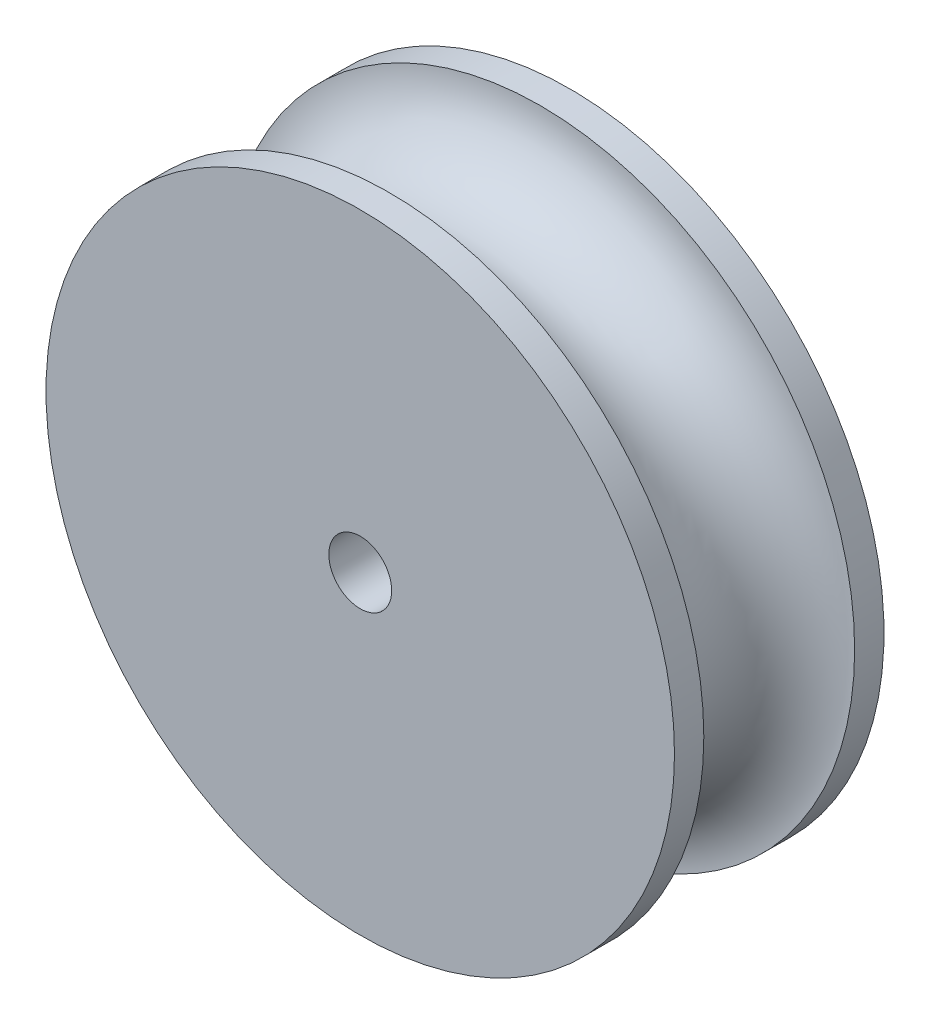
ISO-10303-21;
HEADER;
FILE_DESCRIPTION(('STEP AP214'),'2;1');
FILE_NAME('part.step','',(''),(''),'','','');
FILE_SCHEMA(('AUTOMOTIVE_DESIGN { 1 0 10303 214 1 1 1 1 }'));
ENDSEC;
DATA;
#1=APPLICATION_CONTEXT('core data for automotive mechanical design processes');
#2=APPLICATION_PROTOCOL_DEFINITION('international standard','automotive_design',2000,#1);
#3=PRODUCT_CONTEXT('',#1,'mechanical');
#4=PRODUCT('Part','Part','',(#3));
#5=PRODUCT_RELATED_PRODUCT_CATEGORY('part','',(#4));
#6=PRODUCT_DEFINITION_FORMATION('','',#4);
#7=PRODUCT_DEFINITION_CONTEXT('part definition',#1,'design');
#8=PRODUCT_DEFINITION('design','',#6,#7);
#9=PRODUCT_DEFINITION_SHAPE('','',#8);
#10=(LENGTH_UNIT() NAMED_UNIT(*) SI_UNIT(.MILLI.,.METRE.));
#11=(NAMED_UNIT(*) PLANE_ANGLE_UNIT() SI_UNIT($,.RADIAN.));
#12=(NAMED_UNIT(*) SI_UNIT($,.STERADIAN.) SOLID_ANGLE_UNIT());
#13=UNCERTAINTY_MEASURE_WITH_UNIT(LENGTH_MEASURE(1.E-05),#10,'distance_accuracy_value','');
#14=(GEOMETRIC_REPRESENTATION_CONTEXT(3) GLOBAL_UNCERTAINTY_ASSIGNED_CONTEXT((#13)) GLOBAL_UNIT_ASSIGNED_CONTEXT((#10,
#11,#12)) REPRESENTATION_CONTEXT('',''));
#15=CARTESIAN_POINT('',(0.,0.,0.));
#16=DIRECTION('',(0.,0.,1.));
#17=DIRECTION('',(1.,0.,0.));
#18=AXIS2_PLACEMENT_3D('',#15,#16,#17);
#19=CARTESIAN_POINT('',(0.,0.,-9.144));
#20=DIRECTION('',(0.,0.,1.));
#21=DIRECTION('',(1.,0.,0.));
#22=AXIS2_PLACEMENT_3D('',#19,#20,#21);
#23=TOROIDAL_SURFACE('',#22,38.1,9.144);
#24=CARTESIAN_POINT('',(0.,0.,0.));
#25=DIRECTION('',(0.,0.,1.));
#26=DIRECTION('',(1.,0.,0.));
#27=AXIS2_PLACEMENT_3D('',#24,#25,#26);
#28=CIRCLE('',#27,38.1);
#29=CARTESIAN_POINT('',(38.1,0.,0.));
#30=VERTEX_POINT('',#29);
#31=EDGE_CURVE('E10',#30,#30,#28,.T.);
#32=ORIENTED_EDGE('',*,*,#31,.F.);
#33=EDGE_LOOP('',(#32));
#34=FACE_BOUND('',#33,.T.);
#35=CARTESIAN_POINT('',(0.,0.,-18.288));
#36=DIRECTION('',(0.,0.,-1.));
#37=DIRECTION('',(-1.,0.,0.));
#38=AXIS2_PLACEMENT_3D('',#35,#36,#37);
#39=CIRCLE('',#38,38.1);
#40=CARTESIAN_POINT('',(-38.1,0.,-18.288));
#41=VERTEX_POINT('',#40);
#42=EDGE_CURVE('E57',#41,#41,#39,.T.);
#43=ORIENTED_EDGE('',*,*,#42,.F.);
#44=EDGE_LOOP('',(#43));
#45=FACE_BOUND('',#44,.T.);
#46=ADVANCED_FACE('F40',(#34,#45),#23,.F.);
#47=CARTESIAN_POINT('',(0.,0.,3.556));
#48=DIRECTION('',(0.,0.,-1.));
#49=DIRECTION('',(-1.,0.,0.));
#50=AXIS2_PLACEMENT_3D('',#47,#48,#49);
#51=CYLINDRICAL_SURFACE('',#50,38.1);
#52=CARTESIAN_POINT('',(0.,0.,3.556));
#53=DIRECTION('',(0.,0.,1.));
#54=DIRECTION('',(1.,0.,0.));
#55=AXIS2_PLACEMENT_3D('',#52,#53,#54);
#56=CIRCLE('',#55,38.1);
#57=CARTESIAN_POINT('',(38.1,0.,3.556));
#58=VERTEX_POINT('',#57);
#59=EDGE_CURVE('E47',#58,#58,#56,.T.);
#60=ORIENTED_EDGE('',*,*,#59,.F.);
#61=EDGE_LOOP('',(#60));
#62=FACE_BOUND('',#61,.T.);
#63=ORIENTED_EDGE('',*,*,#31,.T.);
#64=EDGE_LOOP('',(#63));
#65=FACE_BOUND('',#64,.T.);
#66=ADVANCED_FACE('F77',(#62,#65),#51,.T.);
#67=CARTESIAN_POINT('',(0.,0.,3.556));
#68=DIRECTION('',(0.,0.,1.));
#69=DIRECTION('',(1.,0.,0.));
#70=AXIS2_PLACEMENT_3D('',#67,#68,#69);
#71=PLANE('',#70);
#72=CARTESIAN_POINT('',(0.,0.,3.556));
#73=DIRECTION('',(0.,0.,1.));
#74=DIRECTION('',(1.,0.,0.));
#75=AXIS2_PLACEMENT_3D('',#72,#73,#74);
#76=CIRCLE('',#75,3.81);
#77=CARTESIAN_POINT('',(3.81,0.,3.556));
#78=VERTEX_POINT('',#77);
#79=EDGE_CURVE('E67',#78,#78,#76,.T.);
#80=ORIENTED_EDGE('',*,*,#79,.F.);
#81=EDGE_LOOP('',(#80));
#82=FACE_BOUND('',#81,.T.);
#83=ORIENTED_EDGE('',*,*,#59,.T.);
#84=EDGE_LOOP('',(#83));
#85=FACE_BOUND('',#84,.T.);
#86=ADVANCED_FACE('F74',(#82,#85),#71,.T.);
#87=CARTESIAN_POINT('',(0.,0.,-21.844));
#88=DIRECTION('',(0.,0.,1.));
#89=DIRECTION('',(1.,0.,0.));
#90=AXIS2_PLACEMENT_3D('',#87,#88,#89);
#91=CYLINDRICAL_SURFACE('',#90,38.1);
#92=CARTESIAN_POINT('',(0.,0.,-21.844));
#93=DIRECTION('',(0.,0.,-1.));
#94=DIRECTION('',(-1.,0.,0.));
#95=AXIS2_PLACEMENT_3D('',#92,#93,#94);
#96=CIRCLE('',#95,38.1);
#97=CARTESIAN_POINT('',(-38.1,0.,-21.844));
#98=VERTEX_POINT('',#97);
#99=EDGE_CURVE('E52',#98,#98,#96,.T.);
#100=ORIENTED_EDGE('',*,*,#99,.F.);
#101=EDGE_LOOP('',(#100));
#102=FACE_BOUND('',#101,.T.);
#103=ORIENTED_EDGE('',*,*,#42,.T.);
#104=EDGE_LOOP('',(#103));
#105=FACE_BOUND('',#104,.T.);
#106=ADVANCED_FACE('F76',(#102,#105),#91,.T.);
#107=CARTESIAN_POINT('',(0.,0.,-21.844));
#108=DIRECTION('',(0.,0.,-1.));
#109=DIRECTION('',(-1.,0.,0.));
#110=AXIS2_PLACEMENT_3D('',#107,#108,#109);
#111=PLANE('',#110);
#112=CARTESIAN_POINT('',(0.,0.,-21.844));
#113=DIRECTION('',(0.,0.,1.));
#114=DIRECTION('',(1.,0.,0.));
#115=AXIS2_PLACEMENT_3D('',#112,#113,#114);
#116=CIRCLE('',#115,3.81);
#117=CARTESIAN_POINT('',(3.81,0.,-21.844));
#118=VERTEX_POINT('',#117);
#119=EDGE_CURVE('E62',#118,#118,#116,.T.);
#120=ORIENTED_EDGE('',*,*,#119,.T.);
#121=EDGE_LOOP('',(#120));
#122=FACE_BOUND('',#121,.T.);
#123=ORIENTED_EDGE('',*,*,#99,.T.);
#124=EDGE_LOOP('',(#123));
#125=FACE_BOUND('',#124,.T.);
#126=ADVANCED_FACE('F83',(#122,#125),#111,.T.);
#127=CARTESIAN_POINT('',(0.,0.,3.556));
#128=DIRECTION('',(0.,0.,1.));
#129=DIRECTION('',(1.,0.,0.));
#130=AXIS2_PLACEMENT_3D('',#127,#128,#129);
#131=CYLINDRICAL_SURFACE('',#130,3.81);
#132=ORIENTED_EDGE('',*,*,#119,.F.);
#133=EDGE_LOOP('',(#132));
#134=FACE_BOUND('',#133,.T.);
#135=ORIENTED_EDGE('',*,*,#79,.T.);
#136=EDGE_LOOP('',(#135));
#137=FACE_BOUND('',#136,.T.);
#138=ADVANCED_FACE('F72',(#134,#137),#131,.F.);
#139=CLOSED_SHELL('',(#46,#66,#86,#106,#126,#138));
#140=MANIFOLD_SOLID_BREP('B2',#139);
#141=ADVANCED_BREP_SHAPE_REPRESENTATION('',(#18,#140),#14);
#142=SHAPE_DEFINITION_REPRESENTATION(#9,#141);
ENDSEC;
END-ISO-10303-21;
